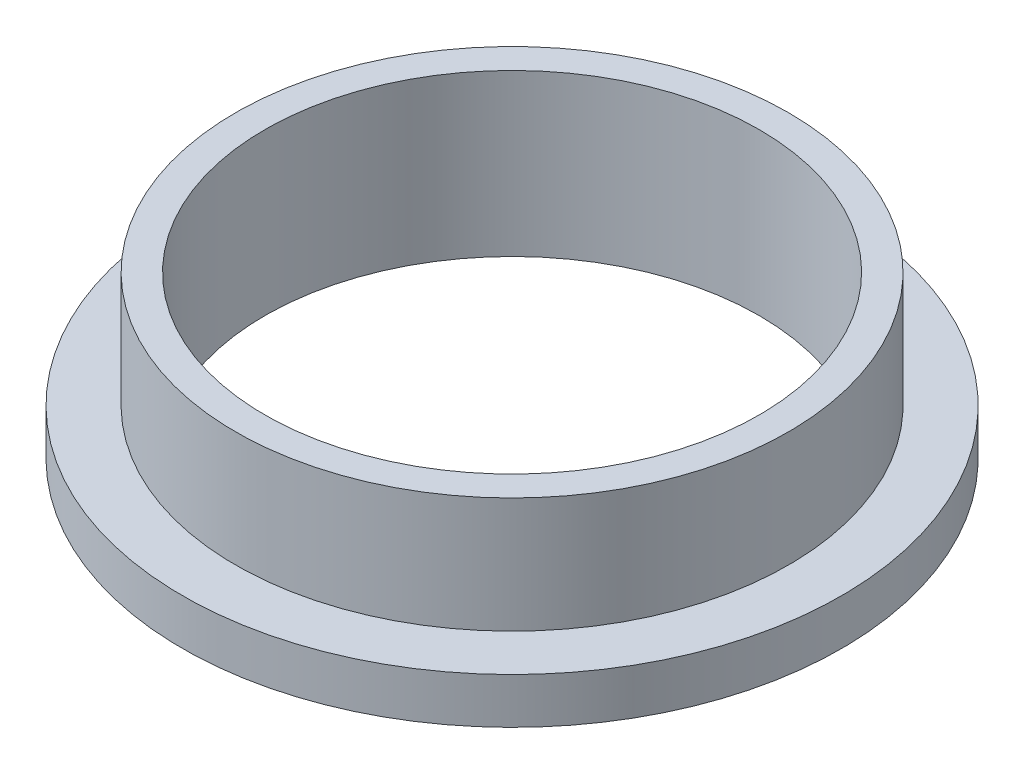
ISO-10303-21;
HEADER;
FILE_DESCRIPTION(('STEP AP214'),'2;1');
FILE_NAME('part.step','',(''),(''),'','','');
FILE_SCHEMA(('AUTOMOTIVE_DESIGN { 1 0 10303 214 1 1 1 1 }'));
ENDSEC;
DATA;
#1=APPLICATION_CONTEXT('core data for automotive mechanical design processes');
#2=APPLICATION_PROTOCOL_DEFINITION('international standard','automotive_design',2000,#1);
#3=PRODUCT_CONTEXT('',#1,'mechanical');
#4=PRODUCT('Part','Part','',(#3));
#5=PRODUCT_RELATED_PRODUCT_CATEGORY('part','',(#4));
#6=PRODUCT_DEFINITION_FORMATION('','',#4);
#7=PRODUCT_DEFINITION_CONTEXT('part definition',#1,'design');
#8=PRODUCT_DEFINITION('design','',#6,#7);
#9=PRODUCT_DEFINITION_SHAPE('','',#8);
#10=(LENGTH_UNIT() NAMED_UNIT(*) SI_UNIT(.MILLI.,.METRE.));
#11=(NAMED_UNIT(*) PLANE_ANGLE_UNIT() SI_UNIT($,.RADIAN.));
#12=(NAMED_UNIT(*) SI_UNIT($,.STERADIAN.) SOLID_ANGLE_UNIT());
#13=UNCERTAINTY_MEASURE_WITH_UNIT(LENGTH_MEASURE(1.E-05),#10,'distance_accuracy_value','');
#14=(GEOMETRIC_REPRESENTATION_CONTEXT(3) GLOBAL_UNCERTAINTY_ASSIGNED_CONTEXT((#13)) GLOBAL_UNIT_ASSIGNED_CONTEXT((#10,
#11,#12)) REPRESENTATION_CONTEXT('',''));
#15=CARTESIAN_POINT('',(0.,0.,0.));
#16=DIRECTION('',(0.,0.,1.));
#17=DIRECTION('',(1.,0.,0.));
#18=AXIS2_PLACEMENT_3D('',#15,#16,#17);
#19=CARTESIAN_POINT('',(0.,0.,-9.));
#20=DIRECTION('',(0.,-1.,0.));
#21=DIRECTION('',(0.,0.,-1.));
#22=AXIS2_PLACEMENT_3D('',#19,#20,#21);
#23=PLANE('',#22);
#24=CARTESIAN_POINT('',(0.,0.,0.));
#25=DIRECTION('',(0.,-1.,0.));
#26=DIRECTION('',(0.,0.,-1.));
#27=AXIS2_PLACEMENT_3D('',#24,#25,#26);
#28=CIRCLE('',#27,9.);
#29=CARTESIAN_POINT('',(0.,0.,-9.));
#30=VERTEX_POINT('',#29);
#31=EDGE_CURVE('E53',#30,#30,#28,.T.);
#32=ORIENTED_EDGE('',*,*,#31,.T.);
#33=EDGE_LOOP('',(#32));
#34=FACE_BOUND('',#33,.T.);
#35=CARTESIAN_POINT('',(0.,0.,0.));
#36=DIRECTION('',(0.,-1.,0.));
#37=DIRECTION('',(0.,0.,-1.));
#38=AXIS2_PLACEMENT_3D('',#35,#36,#37);
#39=CIRCLE('',#38,6.75);
#40=CARTESIAN_POINT('',(0.,0.,-6.75));
#41=VERTEX_POINT('',#40);
#42=EDGE_CURVE('E10',#41,#41,#39,.T.);
#43=ORIENTED_EDGE('',*,*,#42,.F.);
#44=EDGE_LOOP('',(#43));
#45=FACE_BOUND('',#44,.T.);
#46=ADVANCED_FACE('F31',(#34,#45),#23,.T.);
#47=CARTESIAN_POINT('',(0.,0.,0.));
#48=DIRECTION('',(0.,-1.,0.));
#49=DIRECTION('',(0.,0.,-1.));
#50=AXIS2_PLACEMENT_3D('',#47,#48,#49);
#51=CYLINDRICAL_SURFACE('',#50,6.75);
#52=ORIENTED_EDGE('',*,*,#42,.T.);
#53=EDGE_LOOP('',(#52));
#54=FACE_BOUND('',#53,.T.);
#55=CARTESIAN_POINT('',(0.,4.4,0.));
#56=DIRECTION('',(0.,-1.,0.));
#57=DIRECTION('',(0.,0.,-1.));
#58=AXIS2_PLACEMENT_3D('',#55,#56,#57);
#59=CIRCLE('',#58,6.75);
#60=CARTESIAN_POINT('',(0.,4.4,-6.75));
#61=VERTEX_POINT('',#60);
#62=EDGE_CURVE('E37',#61,#61,#59,.T.);
#63=ORIENTED_EDGE('',*,*,#62,.F.);
#64=EDGE_LOOP('',(#63));
#65=FACE_BOUND('',#64,.T.);
#66=ADVANCED_FACE('F71',(#54,#65),#51,.F.);
#67=CARTESIAN_POINT('',(0.,4.4,-6.75));
#68=DIRECTION('',(0.,1.,0.));
#69=DIRECTION('',(0.,0.,1.));
#70=AXIS2_PLACEMENT_3D('',#67,#68,#69);
#71=PLANE('',#70);
#72=ORIENTED_EDGE('',*,*,#62,.T.);
#73=EDGE_LOOP('',(#72));
#74=FACE_BOUND('',#73,.T.);
#75=CARTESIAN_POINT('',(0.,4.4,0.));
#76=DIRECTION('',(0.,-1.,0.));
#77=DIRECTION('',(0.,0.,-1.));
#78=AXIS2_PLACEMENT_3D('',#75,#76,#77);
#79=CIRCLE('',#78,7.55);
#80=CARTESIAN_POINT('',(0.,4.4,-7.55));
#81=VERTEX_POINT('',#80);
#82=EDGE_CURVE('E41',#81,#81,#79,.T.);
#83=ORIENTED_EDGE('',*,*,#82,.F.);
#84=EDGE_LOOP('',(#83));
#85=FACE_BOUND('',#84,.T.);
#86=ADVANCED_FACE('F75',(#74,#85),#71,.T.);
#87=CARTESIAN_POINT('',(0.,0.,0.));
#88=DIRECTION('',(0.,-1.,0.));
#89=DIRECTION('',(0.,0.,-1.));
#90=AXIS2_PLACEMENT_3D('',#87,#88,#89);
#91=CYLINDRICAL_SURFACE('',#90,7.55);
#92=ORIENTED_EDGE('',*,*,#82,.T.);
#93=EDGE_LOOP('',(#92));
#94=FACE_BOUND('',#93,.T.);
#95=CARTESIAN_POINT('',(0.,1.25,0.));
#96=DIRECTION('',(0.,-1.,0.));
#97=DIRECTION('',(0.,0.,-1.));
#98=AXIS2_PLACEMENT_3D('',#95,#96,#97);
#99=CIRCLE('',#98,7.55);
#100=CARTESIAN_POINT('',(0.,1.25,-7.55));
#101=VERTEX_POINT('',#100);
#102=EDGE_CURVE('E45',#101,#101,#99,.T.);
#103=ORIENTED_EDGE('',*,*,#102,.F.);
#104=EDGE_LOOP('',(#103));
#105=FACE_BOUND('',#104,.T.);
#106=ADVANCED_FACE('F67',(#94,#105),#91,.T.);
#107=CARTESIAN_POINT('',(0.,1.25,-7.55));
#108=DIRECTION('',(0.,1.,0.));
#109=DIRECTION('',(0.,0.,1.));
#110=AXIS2_PLACEMENT_3D('',#107,#108,#109);
#111=PLANE('',#110);
#112=ORIENTED_EDGE('',*,*,#102,.T.);
#113=EDGE_LOOP('',(#112));
#114=FACE_BOUND('',#113,.T.);
#115=CARTESIAN_POINT('',(0.,1.25,0.));
#116=DIRECTION('',(0.,-1.,0.));
#117=DIRECTION('',(0.,0.,-1.));
#118=AXIS2_PLACEMENT_3D('',#115,#116,#117);
#119=CIRCLE('',#118,9.);
#120=CARTESIAN_POINT('',(0.,1.25,-9.));
#121=VERTEX_POINT('',#120);
#122=EDGE_CURVE('E50',#121,#121,#119,.T.);
#123=ORIENTED_EDGE('',*,*,#122,.F.);
#124=EDGE_LOOP('',(#123));
#125=FACE_BOUND('',#124,.T.);
#126=ADVANCED_FACE('F61',(#114,#125),#111,.T.);
#127=CARTESIAN_POINT('',(0.,0.,0.));
#128=DIRECTION('',(0.,-1.,0.));
#129=DIRECTION('',(0.,0.,-1.));
#130=AXIS2_PLACEMENT_3D('',#127,#128,#129);
#131=CYLINDRICAL_SURFACE('',#130,9.);
#132=ORIENTED_EDGE('',*,*,#122,.T.);
#133=EDGE_LOOP('',(#132));
#134=FACE_BOUND('',#133,.T.);
#135=ORIENTED_EDGE('',*,*,#31,.F.);
#136=EDGE_LOOP('',(#135));
#137=FACE_BOUND('',#136,.T.);
#138=ADVANCED_FACE('F59',(#134,#137),#131,.T.);
#139=CLOSED_SHELL('',(#46,#66,#86,#106,#126,#138));
#140=MANIFOLD_SOLID_BREP('B2',#139);
#141=ADVANCED_BREP_SHAPE_REPRESENTATION('',(#18,#140),#14);
#142=SHAPE_DEFINITION_REPRESENTATION(#9,#141);
ENDSEC;
END-ISO-10303-21;
